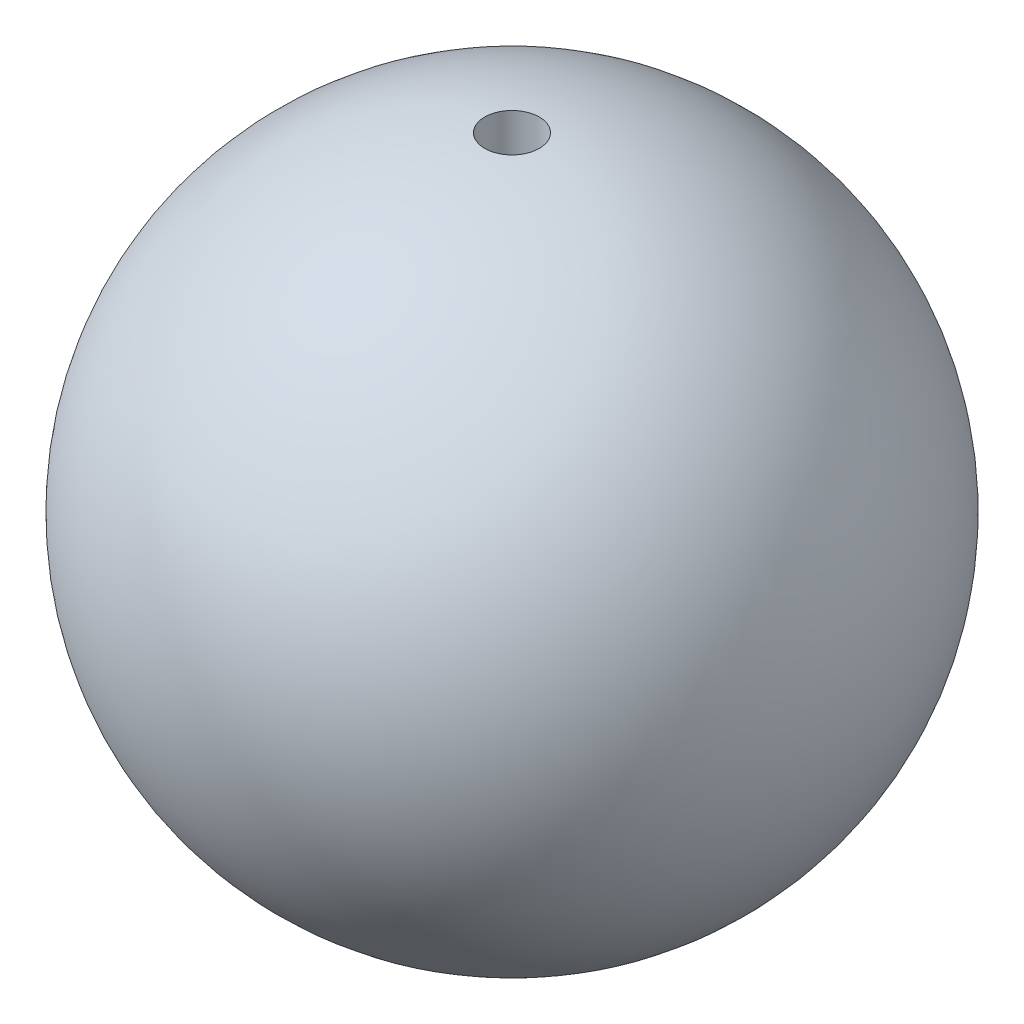
ISO-10303-21;
HEADER;
FILE_DESCRIPTION(('STEP AP214'),'2;1');
FILE_NAME('part.step','',(''),(''),'','','');
FILE_SCHEMA(('AUTOMOTIVE_DESIGN { 1 0 10303 214 1 1 1 1 }'));
ENDSEC;
DATA;
#1=APPLICATION_CONTEXT('core data for automotive mechanical design processes');
#2=APPLICATION_PROTOCOL_DEFINITION('international standard','automotive_design',2000,#1);
#3=PRODUCT_CONTEXT('',#1,'mechanical');
#4=PRODUCT('Part','Part','',(#3));
#5=PRODUCT_RELATED_PRODUCT_CATEGORY('part','',(#4));
#6=PRODUCT_DEFINITION_FORMATION('','',#4);
#7=PRODUCT_DEFINITION_CONTEXT('part definition',#1,'design');
#8=PRODUCT_DEFINITION('design','',#6,#7);
#9=PRODUCT_DEFINITION_SHAPE('','',#8);
#10=(LENGTH_UNIT() NAMED_UNIT(*) SI_UNIT(.MILLI.,.METRE.));
#11=(NAMED_UNIT(*) PLANE_ANGLE_UNIT() SI_UNIT($,.RADIAN.));
#12=(NAMED_UNIT(*) SI_UNIT($,.STERADIAN.) SOLID_ANGLE_UNIT());
#13=UNCERTAINTY_MEASURE_WITH_UNIT(LENGTH_MEASURE(1.E-05),#10,'distance_accuracy_value','');
#14=(GEOMETRIC_REPRESENTATION_CONTEXT(3) GLOBAL_UNCERTAINTY_ASSIGNED_CONTEXT((#13)) GLOBAL_UNIT_ASSIGNED_CONTEXT((#10,
#11,#12)) REPRESENTATION_CONTEXT('',''));
#15=CARTESIAN_POINT('',(0.,0.,0.));
#16=DIRECTION('',(0.,0.,1.));
#17=DIRECTION('',(1.,0.,0.));
#18=AXIS2_PLACEMENT_3D('',#15,#16,#17);
#19=CARTESIAN_POINT('',(0.,0.,0.));
#20=DIRECTION('',(0.,1.,0.));
#21=DIRECTION('',(1.,0.,0.));
#22=AXIS2_PLACEMENT_3D('',#19,#20,#21);
#23=SPHERICAL_SURFACE('',#22,19.05);
#24=CARTESIAN_POINT('',(0.,18.9847966794485,0.));
#25=DIRECTION('',(0.,-1.,0.));
#26=DIRECTION('',(0.,0.,-1.));
#27=AXIS2_PLACEMENT_3D('',#24,#25,#26);
#28=CIRCLE('',#27,1.5748);
#29=CARTESIAN_POINT('',(0.,18.9847966794485,-1.5748));
#30=VERTEX_POINT('',#29);
#31=EDGE_CURVE('E10',#30,#30,#28,.F.);
#32=ORIENTED_EDGE('',*,*,#31,.F.);
#33=EDGE_LOOP('',(#32));
#34=FACE_BOUND('',#33,.T.);
#35=ADVANCED_FACE('F28',(#34),#23,.T.);
#36=CARTESIAN_POINT('',(0.,19.05,0.));
#37=DIRECTION('',(0.,-1.,0.));
#38=DIRECTION('',(0.,0.,-1.));
#39=AXIS2_PLACEMENT_3D('',#36,#37,#38);
#40=CYLINDRICAL_SURFACE('',#39,1.5748);
#41=CARTESIAN_POINT('',(0.,0.,0.));
#42=DIRECTION('',(0.,1.,0.));
#43=DIRECTION('',(0.,0.,1.));
#44=AXIS2_PLACEMENT_3D('',#41,#42,#43);
#45=CIRCLE('',#44,1.5748);
#46=CARTESIAN_POINT('',(0.,0.,-1.5748));
#47=VERTEX_POINT('',#46);
#48=EDGE_CURVE('E34',#47,#47,#45,.T.);
#49=CARTESIAN_POINT('',(0.,0.,-1.5748));
#50=CARTESIAN_POINT('',(0.,0.197758298744255,-1.5748));
#51=CARTESIAN_POINT('',(0.,0.395516597488511,-1.5748));
#52=CARTESIAN_POINT('',(0.,0.791033194977022,-1.5748));
#53=CARTESIAN_POINT('',(0.,0.988791493721277,-1.5748));
#54=CARTESIAN_POINT('',(0.,1.38430809120979,-1.5748));
#55=CARTESIAN_POINT('',(0.,1.58206638995405,-1.5748));
#56=CARTESIAN_POINT('',(0.,1.97758298744256,-1.5748));
#57=CARTESIAN_POINT('',(0.,2.17534128618681,-1.5748));
#58=CARTESIAN_POINT('',(0.,2.57085788367532,-1.5748));
#59=CARTESIAN_POINT('',(0.,2.76861618241958,-1.5748));
#60=CARTESIAN_POINT('',(0.,3.16413277990809,-1.5748));
#61=CARTESIAN_POINT('',(0.,3.36189107865235,-1.5748));
#62=CARTESIAN_POINT('',(0.,3.75740767614086,-1.5748));
#63=CARTESIAN_POINT('',(0.,3.95516597488511,-1.5748));
#64=CARTESIAN_POINT('',(0.,4.35068257237362,-1.5748));
#65=CARTESIAN_POINT('',(0.,4.54844087111788,-1.5748));
#66=CARTESIAN_POINT('',(0.,4.94395746860639,-1.5748));
#67=CARTESIAN_POINT('',(0.,5.14171576735065,-1.5748));
#68=CARTESIAN_POINT('',(0.,5.53723236483916,-1.5748));
#69=CARTESIAN_POINT('',(0.,5.73499066358341,-1.5748));
#70=CARTESIAN_POINT('',(0.,6.13050726107192,-1.5748));
#71=CARTESIAN_POINT('',(0.,6.32826555981618,-1.5748));
#72=CARTESIAN_POINT('',(0.,6.72378215730469,-1.5748));
#73=CARTESIAN_POINT('',(0.,6.92154045604895,-1.5748));
#74=CARTESIAN_POINT('',(0.,7.31705705353746,-1.5748));
#75=CARTESIAN_POINT('',(0.,7.51481535228171,-1.5748));
#76=CARTESIAN_POINT('',(0.,7.91033194977023,-1.5748));
#77=CARTESIAN_POINT('',(0.,8.10809024851448,-1.5748));
#78=CARTESIAN_POINT('',(0.,8.50360684600299,-1.5748));
#79=CARTESIAN_POINT('',(0.,8.70136514474725,-1.5748));
#80=CARTESIAN_POINT('',(0.,9.09688174223576,-1.5748));
#81=CARTESIAN_POINT('',(0.,9.29464004098002,-1.5748));
#82=CARTESIAN_POINT('',(0.,9.69015663846853,-1.5748));
#83=CARTESIAN_POINT('',(0.,9.88791493721278,-1.5748));
#84=CARTESIAN_POINT('',(0.,10.2834315347013,-1.5748));
#85=CARTESIAN_POINT('',(0.,10.4811898334455,-1.5748));
#86=CARTESIAN_POINT('',(0.,10.8767064309341,-1.5748));
#87=CARTESIAN_POINT('',(0.,11.0744647296783,-1.5748));
#88=CARTESIAN_POINT('',(0.,11.4699813271668,-1.5748));
#89=CARTESIAN_POINT('',(0.,11.6677396259111,-1.5748));
#90=CARTESIAN_POINT('',(0.,12.0632562233996,-1.5748));
#91=CARTESIAN_POINT('',(0.,12.2610145221438,-1.5748));
#92=CARTESIAN_POINT('',(0.,12.6565311196324,-1.5748));
#93=CARTESIAN_POINT('',(0.,12.8542894183766,-1.5748));
#94=CARTESIAN_POINT('',(0.,13.2498060158651,-1.5748));
#95=CARTESIAN_POINT('',(0.,13.4475643146094,-1.5748));
#96=CARTESIAN_POINT('',(0.,13.8430809120979,-1.5748));
#97=CARTESIAN_POINT('',(0.,14.0408392108422,-1.5748));
#98=CARTESIAN_POINT('',(0.,14.4363558083307,-1.5748));
#99=CARTESIAN_POINT('',(0.,14.6341141070749,-1.5748));
#100=CARTESIAN_POINT('',(0.,15.0296307045634,-1.5748));
#101=CARTESIAN_POINT('',(0.,15.2273890033077,-1.5748));
#102=CARTESIAN_POINT('',(0.,15.6229056007962,-1.5748));
#103=CARTESIAN_POINT('',(0.,15.8206638995405,-1.5748));
#104=CARTESIAN_POINT('',(0.,16.216180497029,-1.5748));
#105=CARTESIAN_POINT('',(0.,16.4139387957732,-1.5748));
#106=CARTESIAN_POINT('',(0.,16.8094553932617,-1.5748));
#107=CARTESIAN_POINT('',(0.,17.007213692006,-1.5748));
#108=CARTESIAN_POINT('',(0.,17.4027302894945,-1.5748));
#109=CARTESIAN_POINT('',(0.,17.6004885882388,-1.5748));
#110=CARTESIAN_POINT('',(0.,17.9960051857273,-1.5748));
#111=CARTESIAN_POINT('',(0.,18.1937634844715,-1.5748));
#112=CARTESIAN_POINT('',(0.,18.58928008196,-1.5748));
#113=CARTESIAN_POINT('',(0.,18.7870383807043,-1.5748));
#114=CARTESIAN_POINT('',(0.,18.9847966794485,-1.5748));
#115=B_SPLINE_CURVE_WITH_KNOTS('',3,(#49,#50,#51,#52,#53,#54,#55,#56,#57,#58,#59,#60,#61,#62,
#63,#64,#65,#66,#67,#68,#69,#70,#71,#72,#73,#74,#75,#76,#77,#78,#79,#80,#81,#82,#83,#84,#85,#86,
#87,#88,#89,#90,#91,#92,#93,#94,#95,#96,#97,#98,#99,#100,#101,#102,#103,#104,#105,#106,#107,
#108,#109,#110,#111,#112,#113,#114),.UNSPECIFIED.,.F.,.F.,(4,2,2,2,2,2,2,2,2,2,2,2,2,2,2,2,2,2,
2,2,2,2,2,2,2,2,2,2,2,2,2,2,4),(0.,0.593274896232766,1.18654979246553,1.7798246886983,
2.37309958493107,2.96637448116384,3.5596493773966,4.15292427362937,4.74619916986213,
5.3394740660949,5.93274896232767,6.52602385856044,7.1192987547932,7.71257365102597,
8.30584854725874,8.8991234434915,9.49239833972427,10.085673235957,10.6789481321898,
11.2722230284226,11.8654979246553,12.4587728208881,13.0520477171209,13.6453226133536,
14.2385975095864,14.8318724058192,15.4251473020519,16.0184221982847,16.6116970945175,
17.2049719907502,17.798246886983,18.3915217832158,18.9847966794485),.UNSPECIFIED.);
#116=EDGE_CURVE('BSEAM42',#47,#30,#115,.T.);
#117=ORIENTED_EDGE('',*,*,#48,.F.);
#118=ORIENTED_EDGE('',*,*,#31,.T.);
#119=ORIENTED_EDGE('',*,*,#116,.T.);
#120=ORIENTED_EDGE('',*,*,#116,.F.);
#121=EDGE_LOOP('',(#117,#119,#118,#120));
#122=FACE_BOUND('',#121,.T.);
#123=ADVANCED_FACE('F42',(#122),#40,.F.);
#124=CARTESIAN_POINT('',(0.,0.,0.));
#125=DIRECTION('',(0.,1.,0.));
#126=DIRECTION('',(0.,0.,1.));
#127=AXIS2_PLACEMENT_3D('',#124,#125,#126);
#128=PLANE('',#127);
#129=ORIENTED_EDGE('',*,*,#48,.T.);
#130=EDGE_LOOP('',(#129));
#131=FACE_BOUND('',#130,.T.);
#132=ADVANCED_FACE('F40',(#131),#128,.T.);
#133=CLOSED_SHELL('',(#35,#123,#132));
#134=MANIFOLD_SOLID_BREP('B2',#133);
#135=ADVANCED_BREP_SHAPE_REPRESENTATION('',(#18,#134),#14);
#136=SHAPE_DEFINITION_REPRESENTATION(#9,#135);
ENDSEC;
END-ISO-10303-21;
